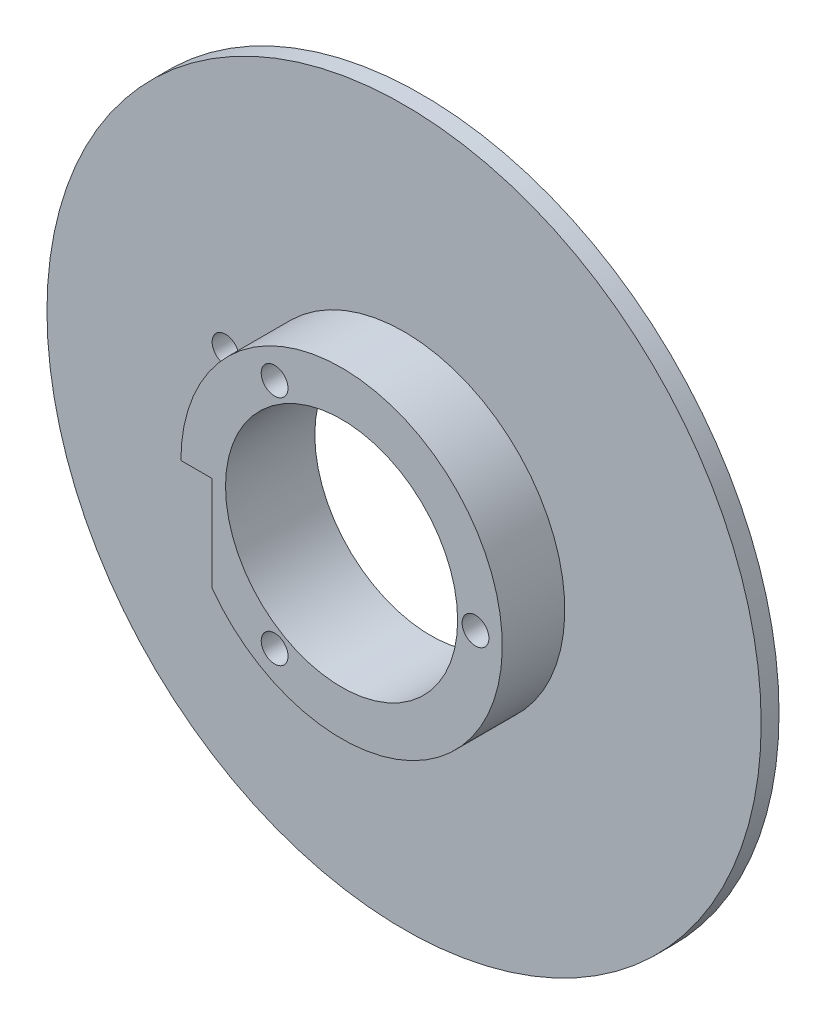
ISO-10303-21;
HEADER;
FILE_DESCRIPTION(('STEP AP214'),'2;1');
FILE_NAME('part.step','',(''),(''),'','','');
FILE_SCHEMA(('AUTOMOTIVE_DESIGN { 1 0 10303 214 1 1 1 1 }'));
ENDSEC;
DATA;
#1=APPLICATION_CONTEXT('core data for automotive mechanical design processes');
#2=APPLICATION_PROTOCOL_DEFINITION('international standard','automotive_design',2000,#1);
#3=PRODUCT_CONTEXT('',#1,'mechanical');
#4=PRODUCT('Part','Part','',(#3));
#5=PRODUCT_RELATED_PRODUCT_CATEGORY('part','',(#4));
#6=PRODUCT_DEFINITION_FORMATION('','',#4);
#7=PRODUCT_DEFINITION_CONTEXT('part definition',#1,'design');
#8=PRODUCT_DEFINITION('design','',#6,#7);
#9=PRODUCT_DEFINITION_SHAPE('','',#8);
#10=(LENGTH_UNIT() NAMED_UNIT(*) SI_UNIT(.MILLI.,.METRE.));
#11=(NAMED_UNIT(*) PLANE_ANGLE_UNIT() SI_UNIT($,.RADIAN.));
#12=(NAMED_UNIT(*) SI_UNIT($,.STERADIAN.) SOLID_ANGLE_UNIT());
#13=UNCERTAINTY_MEASURE_WITH_UNIT(LENGTH_MEASURE(1.E-05),#10,'distance_accuracy_value','');
#14=(GEOMETRIC_REPRESENTATION_CONTEXT(3) GLOBAL_UNCERTAINTY_ASSIGNED_CONTEXT((#13)) GLOBAL_UNIT_ASSIGNED_CONTEXT((#10,
#11,#12)) REPRESENTATION_CONTEXT('',''));
#15=CARTESIAN_POINT('',(0.,0.,0.));
#16=DIRECTION('',(0.,0.,1.));
#17=DIRECTION('',(1.,0.,0.));
#18=AXIS2_PLACEMENT_3D('',#15,#16,#17);
#19=CARTESIAN_POINT('',(0.,0.,-0.001000000000001));
#20=DIRECTION('',(0.,0.,1.));
#21=DIRECTION('',(1.,0.,0.));
#22=AXIS2_PLACEMENT_3D('',#19,#20,#21);
#23=CYLINDRICAL_SURFACE('',#22,13.);
#24=CARTESIAN_POINT('',(0.,0.,12.));
#25=DIRECTION('',(0.,0.,1.));
#26=DIRECTION('',(1.,0.,0.));
#27=AXIS2_PLACEMENT_3D('',#24,#25,#26);
#28=CIRCLE('',#27,13.);
#29=CARTESIAN_POINT('',(13.,0.,12.));
#30=VERTEX_POINT('',#29);
#31=EDGE_CURVE('E100',#30,#30,#28,.T.);
#32=ORIENTED_EDGE('',*,*,#31,.T.);
#33=EDGE_LOOP('',(#32));
#34=FACE_BOUND('',#33,.T.);
#35=CARTESIAN_POINT('',(0.,0.,2.));
#36=DIRECTION('',(0.,0.,-1.));
#37=DIRECTION('',(-1.,0.,0.));
#38=AXIS2_PLACEMENT_3D('',#35,#36,#37);
#39=CIRCLE('',#38,13.);
#40=CARTESIAN_POINT('',(-13.,0.,2.));
#41=VERTEX_POINT('',#40);
#42=EDGE_CURVE('E122',#41,#41,#39,.F.);
#43=ORIENTED_EDGE('',*,*,#42,.F.);
#44=EDGE_LOOP('',(#43));
#45=FACE_BOUND('',#44,.T.);
#46=ADVANCED_FACE('F35',(#34,#45),#23,.F.);
#47=CARTESIAN_POINT('',(-16.,-1.25,0.));
#48=DIRECTION('',(0.,0.,1.));
#49=DIRECTION('',(1.,0.,0.));
#50=AXIS2_PLACEMENT_3D('',#47,#48,#49);
#51=CYLINDRICAL_SURFACE('',#50,1.25);
#52=CARTESIAN_POINT('',(-16.,-1.25,5.));
#53=DIRECTION('',(0.,0.,1.));
#54=DIRECTION('',(1.,0.,0.));
#55=AXIS2_PLACEMENT_3D('',#52,#53,#54);
#56=CIRCLE('',#55,1.25);
#57=CARTESIAN_POINT('',(-16.,0.,5.));
#58=VERTEX_POINT('',#57);
#59=EDGE_CURVE('E50',#58,#58,#56,.T.);
#60=ORIENTED_EDGE('',*,*,#59,.T.);
#61=EDGE_LOOP('',(#60));
#62=FACE_BOUND('',#61,.T.);
#63=CARTESIAN_POINT('',(-16.,-1.25,2.));
#64=DIRECTION('',(0.,0.,-1.));
#65=DIRECTION('',(-1.,0.,0.));
#66=AXIS2_PLACEMENT_3D('',#63,#64,#65);
#67=CIRCLE('',#66,1.25);
#68=CARTESIAN_POINT('',(-17.25,-1.25,2.));
#69=VERTEX_POINT('',#68);
#70=EDGE_CURVE('E237',#69,#69,#67,.F.);
#71=ORIENTED_EDGE('',*,*,#70,.F.);
#72=EDGE_LOOP('',(#71));
#73=FACE_BOUND('',#72,.T.);
#74=ADVANCED_FACE('F166',(#62,#73),#51,.F.);
#75=CARTESIAN_POINT('',(15.,0.,0.));
#76=DIRECTION('',(0.,0.,1.));
#77=DIRECTION('',(1.,0.,0.));
#78=AXIS2_PLACEMENT_3D('',#75,#76,#77);
#79=CYLINDRICAL_SURFACE('',#78,1.5);
#80=CARTESIAN_POINT('',(15.,0.,12.));
#81=DIRECTION('',(0.,0.,1.));
#82=DIRECTION('',(1.,0.,0.));
#83=AXIS2_PLACEMENT_3D('',#80,#81,#82);
#84=CIRCLE('',#83,1.5);
#85=CARTESIAN_POINT('',(16.5,0.,12.));
#86=VERTEX_POINT('',#85);
#87=EDGE_CURVE('E141',#86,#86,#84,.T.);
#88=ORIENTED_EDGE('',*,*,#87,.T.);
#89=EDGE_LOOP('',(#88));
#90=FACE_BOUND('',#89,.T.);
#91=CARTESIAN_POINT('',(15.,0.,2.));
#92=DIRECTION('',(0.,0.,-1.));
#93=DIRECTION('',(-1.,0.,0.));
#94=AXIS2_PLACEMENT_3D('',#91,#92,#93);
#95=CIRCLE('',#94,1.5);
#96=CARTESIAN_POINT('',(13.5,0.,2.));
#97=VERTEX_POINT('',#96);
#98=EDGE_CURVE('E235',#97,#97,#95,.F.);
#99=ORIENTED_EDGE('',*,*,#98,.F.);
#100=EDGE_LOOP('',(#99));
#101=FACE_BOUND('',#100,.T.);
#102=ADVANCED_FACE('F172',(#90,#101),#79,.F.);
#103=CARTESIAN_POINT('',(-7.50000000000006,12.9903810567665,0.));
#104=DIRECTION('',(0.,0.,1.));
#105=DIRECTION('',(1.,0.,0.));
#106=AXIS2_PLACEMENT_3D('',#103,#104,#105);
#107=CYLINDRICAL_SURFACE('',#106,1.5);
#108=CARTESIAN_POINT('',(-7.50000000000006,12.9903810567665,12.));
#109=DIRECTION('',(0.,0.,1.));
#110=DIRECTION('',(-0.500000000000004,0.866025403784436,0.));
#111=AXIS2_PLACEMENT_3D('',#108,#109,#110);
#112=CIRCLE('',#111,1.5);
#113=CARTESIAN_POINT('',(-8.25000000000006,14.2894191624432,12.));
#114=VERTEX_POINT('',#113);
#115=EDGE_CURVE('E138',#114,#114,#112,.T.);
#116=ORIENTED_EDGE('',*,*,#115,.T.);
#117=EDGE_LOOP('',(#116));
#118=FACE_BOUND('',#117,.T.);
#119=CARTESIAN_POINT('',(-7.50000000000006,12.9903810567665,2.));
#120=DIRECTION('',(0.,0.,-1.));
#121=DIRECTION('',(-1.,0.,0.));
#122=AXIS2_PLACEMENT_3D('',#119,#120,#121);
#123=CIRCLE('',#122,1.5);
#124=CARTESIAN_POINT('',(-9.00000000000006,12.9903810567665,2.));
#125=VERTEX_POINT('',#124);
#126=EDGE_CURVE('E232',#125,#125,#123,.F.);
#127=ORIENTED_EDGE('',*,*,#126,.F.);
#128=EDGE_LOOP('',(#127));
#129=FACE_BOUND('',#128,.T.);
#130=ADVANCED_FACE('F184',(#118,#129),#107,.F.);
#131=CARTESIAN_POINT('',(-7.49999999999987,-12.9903810567666,0.));
#132=DIRECTION('',(0.,0.,1.));
#133=DIRECTION('',(1.,0.,0.));
#134=AXIS2_PLACEMENT_3D('',#131,#132,#133);
#135=CYLINDRICAL_SURFACE('',#134,1.5);
#136=CARTESIAN_POINT('',(-7.49999999999987,-12.9903810567666,12.));
#137=DIRECTION('',(0.,0.,1.));
#138=DIRECTION('',(-0.499999999999992,-0.866025403784443,0.));
#139=AXIS2_PLACEMENT_3D('',#136,#137,#138);
#140=CIRCLE('',#139,1.5);
#141=CARTESIAN_POINT('',(-8.24999999999986,-14.2894191624433,12.));
#142=VERTEX_POINT('',#141);
#143=EDGE_CURVE('E135',#142,#142,#140,.T.);
#144=ORIENTED_EDGE('',*,*,#143,.T.);
#145=EDGE_LOOP('',(#144));
#146=FACE_BOUND('',#145,.T.);
#147=CARTESIAN_POINT('',(-7.49999999999987,-12.9903810567666,2.));
#148=DIRECTION('',(0.,0.,-1.));
#149=DIRECTION('',(-1.,0.,0.));
#150=AXIS2_PLACEMENT_3D('',#147,#148,#149);
#151=CIRCLE('',#150,1.5);
#152=CARTESIAN_POINT('',(-8.99999999999987,-12.9903810567666,2.));
#153=VERTEX_POINT('',#152);
#154=EDGE_CURVE('E39',#153,#153,#151,.F.);
#155=ORIENTED_EDGE('',*,*,#154,.F.);
#156=EDGE_LOOP('',(#155));
#157=FACE_BOUND('',#156,.T.);
#158=ADVANCED_FACE('F188',(#146,#157),#135,.F.);
#159=CARTESIAN_POINT('',(0.,0.,5.));
#160=DIRECTION('',(0.,0.,-1.));
#161=DIRECTION('',(-1.,0.,0.));
#162=AXIS2_PLACEMENT_3D('',#159,#160,#161);
#163=CYLINDRICAL_SURFACE('',#162,40.);
#164=CARTESIAN_POINT('',(0.,0.,5.));
#165=DIRECTION('',(0.,0.,1.));
#166=DIRECTION('',(1.,0.,0.));
#167=AXIS2_PLACEMENT_3D('',#164,#165,#166);
#168=CIRCLE('',#167,40.);
#169=CARTESIAN_POINT('',(40.,0.,5.));
#170=VERTEX_POINT('',#169);
#171=EDGE_CURVE('E12',#170,#170,#168,.T.);
#172=ORIENTED_EDGE('',*,*,#171,.F.);
#173=EDGE_LOOP('',(#172));
#174=FACE_BOUND('',#173,.T.);
#175=CARTESIAN_POINT('',(0.,0.,3.));
#176=DIRECTION('',(0.,0.,-1.));
#177=DIRECTION('',(-1.,0.,0.));
#178=AXIS2_PLACEMENT_3D('',#175,#176,#177);
#179=CIRCLE('',#178,40.);
#180=CARTESIAN_POINT('',(-40.,0.,3.));
#181=VERTEX_POINT('',#180);
#182=EDGE_CURVE('E107',#181,#181,#179,.T.);
#183=ORIENTED_EDGE('',*,*,#182,.F.);
#184=EDGE_LOOP('',(#183));
#185=FACE_BOUND('',#184,.T.);
#186=ADVANCED_FACE('F37',(#174,#185),#163,.T.);
#187=CARTESIAN_POINT('',(0.,0.,0.));
#188=DIRECTION('',(0.,0.,1.));
#189=DIRECTION('',(1.,0.,0.));
#190=AXIS2_PLACEMENT_3D('',#187,#188,#189);
#191=PLANE('',#190);
#192=CARTESIAN_POINT('',(0.,0.,0.));
#193=DIRECTION('',(0.,0.,-1.));
#194=DIRECTION('',(-1.,0.,0.));
#195=AXIS2_PLACEMENT_3D('',#192,#193,#194);
#196=CIRCLE('',#195,18.);
#197=CARTESIAN_POINT('',(-18.,0.,0.));
#198=VERTEX_POINT('',#197);
#199=EDGE_CURVE('E225',#198,#198,#196,.T.);
#200=ORIENTED_EDGE('',*,*,#199,.F.);
#201=EDGE_LOOP('',(#200));
#202=FACE_BOUND('',#201,.T.);
#203=CARTESIAN_POINT('',(-19.9999999999999,6.25,0.));
#204=DIRECTION('',(0.,0.,-1.));
#205=DIRECTION('',(-1.,0.,0.));
#206=AXIS2_PLACEMENT_3D('',#203,#204,#205);
#207=CIRCLE('',#206,1.5);
#208=CARTESIAN_POINT('',(-21.5,6.25,0.));
#209=VERTEX_POINT('',#208);
#210=EDGE_CURVE('E129',#209,#209,#207,.T.);
#211=ORIENTED_EDGE('',*,*,#210,.F.);
#212=EDGE_LOOP('',(#211));
#213=FACE_BOUND('',#212,.T.);
#214=CARTESIAN_POINT('',(-20.,-8.75,0.));
#215=DIRECTION('',(0.,0.,-1.));
#216=DIRECTION('',(-1.,0.,0.));
#217=AXIS2_PLACEMENT_3D('',#214,#215,#216);
#218=CIRCLE('',#217,1.5);
#219=CARTESIAN_POINT('',(-21.5,-8.75,0.));
#220=VERTEX_POINT('',#219);
#221=EDGE_CURVE('E109',#220,#220,#218,.T.);
#222=ORIENTED_EDGE('',*,*,#221,.F.);
#223=EDGE_LOOP('',(#222));
#224=FACE_BOUND('',#223,.T.);
#225=CARTESIAN_POINT('',(0.,0.,0.));
#226=DIRECTION('',(0.,0.,-1.));
#227=DIRECTION('',(-1.,0.,0.));
#228=AXIS2_PLACEMENT_3D('',#225,#226,#227);
#229=CIRCLE('',#228,25.);
#230=CARTESIAN_POINT('',(-25.,0.,0.));
#231=VERTEX_POINT('',#230);
#232=EDGE_CURVE('E117',#231,#231,#229,.T.);
#233=ORIENTED_EDGE('',*,*,#232,.T.);
#234=EDGE_LOOP('',(#233));
#235=FACE_BOUND('',#234,.T.);
#236=ADVANCED_FACE('F160',(#202,#213,#224,#235),#191,.F.);
#237=CARTESIAN_POINT('',(0.,0.,5.));
#238=DIRECTION('',(0.,0.,1.));
#239=DIRECTION('',(1.,0.,0.));
#240=AXIS2_PLACEMENT_3D('',#237,#238,#239);
#241=PLANE('',#240);
#242=CARTESIAN_POINT('',(-20.,-8.75,5.));
#243=DIRECTION('',(0.,0.,1.));
#244=DIRECTION('',(1.,0.,0.));
#245=AXIS2_PLACEMENT_3D('',#242,#243,#244);
#246=CIRCLE('',#245,1.5);
#247=CARTESIAN_POINT('',(-18.5,-8.75,5.));
#248=VERTEX_POINT('',#247);
#249=EDGE_CURVE('E114',#248,#248,#246,.T.);
#250=ORIENTED_EDGE('',*,*,#249,.F.);
#251=EDGE_LOOP('',(#250));
#252=FACE_BOUND('',#251,.T.);
#253=CARTESIAN_POINT('',(-19.9999999999999,6.25,5.));
#254=DIRECTION('',(0.,0.,1.));
#255=DIRECTION('',(1.,0.,0.));
#256=AXIS2_PLACEMENT_3D('',#253,#254,#255);
#257=CIRCLE('',#256,1.5);
#258=CARTESIAN_POINT('',(-18.4999999999999,6.25,5.));
#259=VERTEX_POINT('',#258);
#260=EDGE_CURVE('E132',#259,#259,#257,.T.);
#261=ORIENTED_EDGE('',*,*,#260,.F.);
#262=EDGE_LOOP('',(#261));
#263=FACE_BOUND('',#262,.T.);
#264=DIRECTION('',(1.,0.,0.));
#265=VECTOR('',#264,1.);
#266=CARTESIAN_POINT('',(-18.,0.,5.));
#267=LINE('',#266,#265);
#268=CARTESIAN_POINT('',(-14.5,0.,5.));
#269=VERTEX_POINT('',#268);
#270=EDGE_CURVE('E82',#58,#269,#267,.T.);
#271=ORIENTED_EDGE('',*,*,#270,.F.);
#272=ORIENTED_EDGE('',*,*,#59,.F.);
#273=CARTESIAN_POINT('',(-18.,0.,5.));
#274=VERTEX_POINT('',#273);
#275=EDGE_CURVE('E104',#274,#58,#267,.T.);
#276=ORIENTED_EDGE('',*,*,#275,.F.);
#277=CARTESIAN_POINT('',(0.,0.,5.));
#278=DIRECTION('',(0.,0.,1.));
#279=DIRECTION('',(1.,0.,0.));
#280=AXIS2_PLACEMENT_3D('',#277,#278,#279);
#281=CIRCLE('',#280,18.);
#282=CARTESIAN_POINT('',(-14.5,-10.6653645038508,5.));
#283=VERTEX_POINT('',#282);
#284=EDGE_CURVE('E103',#283,#274,#281,.T.);
#285=ORIENTED_EDGE('',*,*,#284,.F.);
#286=DIRECTION('',(0.,-1.,0.));
#287=VECTOR('',#286,1.);
#288=CARTESIAN_POINT('',(-14.5,0.,5.));
#289=LINE('',#288,#287);
#290=EDGE_CURVE('E98',#269,#283,#289,.T.);
#291=ORIENTED_EDGE('',*,*,#290,.F.);
#292=EDGE_LOOP('',(#271,#272,#276,#285,#291));
#293=FACE_BOUND('',#292,.T.);
#294=ORIENTED_EDGE('',*,*,#171,.T.);
#295=EDGE_LOOP('',(#294));
#296=FACE_BOUND('',#295,.T.);
#297=ADVANCED_FACE('F147',(#252,#263,#293,#296),#241,.T.);
#298=CARTESIAN_POINT('',(0.,0.,12.));
#299=DIRECTION('',(0.,0.,-1.));
#300=DIRECTION('',(-1.,0.,0.));
#301=AXIS2_PLACEMENT_3D('',#298,#299,#300);
#302=CYLINDRICAL_SURFACE('',#301,18.);
#303=CARTESIAN_POINT('',(-16.,8.24621125123531,6.99999999999999));
#304=CARTESIAN_POINT('',(-15.9613810360273,8.32114346397686,7.0000016263652));
#305=CARTESIAN_POINT('',(-15.9222363186604,8.39580114899752,7.00223152049244));
#306=CARTESIAN_POINT('',(-15.843035174205,8.54431475928277,7.01159061047103));
#307=CARTESIAN_POINT('',(-15.8029789444741,8.61817085308542,7.01871875534757));
#308=CARTESIAN_POINT('',(-15.7221474509637,8.7647634720665,7.03847526886184));
#309=CARTESIAN_POINT('',(-15.6813722365588,8.83750007348587,7.0511032612113));
#310=CARTESIAN_POINT('',(-15.5994478826954,8.98131842431563,7.08267587815209));
#311=CARTESIAN_POINT('',(-15.5582989842929,9.05240114794279,7.10161667795411));
#312=CARTESIAN_POINT('',(-15.4673718942982,9.20706266816792,7.15173330893178));
#313=CARTESIAN_POINT('',(-15.4176014437032,9.29012041232406,7.18464577802709));
#314=CARTESIAN_POINT('',(-15.3443481539485,9.41027069847238,7.24428853029069));
#315=CARTESIAN_POINT('',(-15.3201944569461,9.44953348183938,7.26584729826322));
#316=CARTESIAN_POINT('',(-15.272684029808,9.52612950820349,7.31288247970974));
#317=CARTESIAN_POINT('',(-15.2493266344292,9.56346437593623,7.33835552002104));
#318=CARTESIAN_POINT('',(-15.2043549540248,9.63479800449547,7.39322030307094));
#319=CARTESIAN_POINT('',(-15.1827148254229,9.66884929503873,7.42252147493258));
#320=CARTESIAN_POINT('',(-15.1413676089115,9.73347078582315,7.48601147810083));
#321=CARTESIAN_POINT('',(-15.1216598950257,9.76404211386482,7.52019871776242));
#322=CARTESIAN_POINT('',(-15.0881076599514,9.81579370684003,7.58811196176378));
#323=CARTESIAN_POINT('',(-15.0738284872362,9.83769475412273,7.62106476641484));
#324=CARTESIAN_POINT('',(-15.0482915236492,9.87671332847282,7.69077335626779));
#325=CARTESIAN_POINT('',(-15.0370284699269,9.89383918998264,7.72752236006487));
#326=CARTESIAN_POINT('',(-15.0205527951927,9.91882899449617,7.79594547367171));
#327=CARTESIAN_POINT('',(-15.0145572700433,9.92789684753955,7.82698729867992));
#328=CARTESIAN_POINT('',(-15.005503064186,9.94157666181556,7.89045487563609));
#329=CARTESIAN_POINT('',(-15.0024420054344,9.94619223112513,7.92287948470144));
#330=CARTESIAN_POINT('',(-14.9995306327531,9.95058232716388,7.98831359222039));
#331=CARTESIAN_POINT('',(-14.9996909162677,9.95034087545491,8.02132466410337));
#332=CARTESIAN_POINT('',(-15.0032326471308,9.94499972722101,8.08677578546125));
#333=CARTESIAN_POINT('',(-15.0066151686016,9.93989841067613,8.11921564085032));
#334=CARTESIAN_POINT('',(-15.0160894273721,9.92557941070428,8.18129138474907));
#335=CARTESIAN_POINT('',(-15.0220634506199,9.91654051634072,8.21098774698774));
#336=CARTESIAN_POINT('',(-15.0362650384914,9.89499371099593,8.2685033842677));
#337=CARTESIAN_POINT('',(-15.0444934392672,9.88248451285221,8.29632195805348));
#338=CARTESIAN_POINT('',(-15.0679248618022,9.84674118511798,8.36495749268957));
#339=CARTESIAN_POINT('',(-15.0844430414207,9.82143894466121,8.40424775550381));
#340=CARTESIAN_POINT('',(-15.1204728618183,9.76587979310348,8.47761001354602));
#341=CARTESIAN_POINT('',(-15.1399928376072,9.73560906988412,8.51166693427089));
#342=CARTESIAN_POINT('',(-15.1937214207466,9.65166280422465,8.59470168661542));
#343=CARTESIAN_POINT('',(-15.2295070422709,9.59515163922994,8.63976323863986));
#344=CARTESIAN_POINT('',(-15.3034560732536,9.47676917608623,8.71957585797191));
#345=CARTESIAN_POINT('',(-15.3416245097552,9.41488643026102,8.75430417026482));
#346=CARTESIAN_POINT('',(-15.415666421671,9.29310899791827,8.81276084790355));
#347=CARTESIAN_POINT('',(-15.4514618818731,9.23348697013425,8.83717000638175));
#348=CARTESIAN_POINT('',(-15.5232745723358,9.11224009653214,8.88004712134471));
#349=CARTESIAN_POINT('',(-15.5592919602388,9.0506136501307,8.89851019477245));
#350=CARTESIAN_POINT('',(-15.631202944733,8.92584394322628,8.93034231513794));
#351=CARTESIAN_POINT('',(-15.6670961713828,8.86269800012377,8.94370152358333));
#352=CARTESIAN_POINT('',(-15.7384470923891,8.73536587952441,8.96591131351949));
#353=CARTESIAN_POINT('',(-15.7739046331667,8.6711793527246,8.97476034728945));
#354=CARTESIAN_POINT('',(-15.8708765476014,8.49305421048156,8.99363143555357));
#355=CARTESIAN_POINT('',(-15.9317522173512,8.37831223842818,8.99945072275903));
#356=CARTESIAN_POINT('',(-16.0510413895161,8.14745289217276,9.0004752596151));
#357=CARTESIAN_POINT('',(-16.1094527045813,8.03133440859103,8.99567127400947));
#358=CARTESIAN_POINT('',(-16.2234765882214,7.79843764772273,8.97642357332456));
#359=CARTESIAN_POINT('',(-16.2790871842455,7.68165896810478,8.9619731636037));
#360=CARTESIAN_POINT('',(-16.3871900481901,7.44825616052386,8.92378256016411));
#361=CARTESIAN_POINT('',(-16.4396844464687,7.33163198153019,8.90004879915618));
#362=CARTESIAN_POINT('',(-16.5164840064985,7.15611392093431,8.8568129877488));
#363=CARTESIAN_POINT('',(-16.5420287883222,7.09685872977176,8.84091064147199));
#364=CARTESIAN_POINT('',(-16.5921970428508,6.97876127683229,8.80636946950834));
#365=CARTESIAN_POINT('',(-16.6168206677166,6.91991894817311,8.7877310982978));
#366=CARTESIAN_POINT('',(-16.6649901437868,6.80309344580329,8.74750864052945));
#367=CARTESIAN_POINT('',(-16.6885398281258,6.74510781441918,8.7259363409095));
#368=CARTESIAN_POINT('',(-16.7345570207122,6.63011543745193,8.6793377808582));
#369=CARTESIAN_POINT('',(-16.7570249782641,6.57310829188943,8.65431297144691));
#370=CARTESIAN_POINT('',(-16.7977070758567,6.46836498738277,8.60379314982165));
#371=CARTESIAN_POINT('',(-16.8160810582034,6.42043276657923,8.57883695645679));
#372=CARTESIAN_POINT('',(-16.8517867363182,6.32612277407133,8.52489174666344));
#373=CARTESIAN_POINT('',(-16.8691135498232,6.27975267225899,8.49588565767342));
#374=CARTESIAN_POINT('',(-16.9024766391883,6.18939712230061,8.43226776447946));
#375=CARTESIAN_POINT('',(-16.9184907910405,6.14545551908967,8.3975813930173));
#376=CARTESIAN_POINT('',(-16.9480085834646,6.06356659572869,8.32087534879257));
#377=CARTESIAN_POINT('',(-16.9615324692576,6.02557135150473,8.27892073789707));
#378=CARTESIAN_POINT('',(-16.9769124462773,5.98202435258441,8.21439244107213));
#379=CARTESIAN_POINT('',(-16.9807859080377,5.9710149865607,8.19604506762374));
#380=CARTESIAN_POINT('',(-16.9876460569709,5.95146922779873,8.15789786378946));
#381=CARTESIAN_POINT('',(-16.9906330619758,5.9429319487398,8.13809855716586));
#382=CARTESIAN_POINT('',(-16.9955021564396,5.92899346240937,8.09699060134567));
#383=CARTESIAN_POINT('',(-16.9973705459889,5.92363114801847,8.07566668165258));
#384=CARTESIAN_POINT('',(-16.9997117126049,5.91690929377916,8.03232618788239));
#385=CARTESIAN_POINT('',(-17.0001865345711,5.91554388893587,8.01031067666598));
#386=CARTESIAN_POINT('',(-16.9997067350194,5.91692237604207,7.96889217205053));
#387=CARTESIAN_POINT('',(-16.9989052208164,5.91922612735466,7.94947094056677));
#388=CARTESIAN_POINT('',(-16.9962433570875,5.92686492298391,7.91130925468124));
#389=CARTESIAN_POINT('',(-16.9943819468858,5.93220300385347,7.89256950227624));
#390=CARTESIAN_POINT('',(-16.988926998587,5.94781040663769,7.84949497956166));
#391=CARTESIAN_POINT('',(-16.9849495056019,5.95916767468341,7.82560848379701));
#392=CARTESIAN_POINT('',(-16.9757806396857,5.98523720822826,7.78000933041884));
#393=CARTESIAN_POINT('',(-16.9705862844414,5.99995771419819,7.75830220383709));
#394=CARTESIAN_POINT('',(-16.9548744059359,6.04426422942778,7.70049784524241));
#395=CARTESIAN_POINT('',(-16.9434011430569,6.07638432036652,7.66663335343101));
#396=CARTESIAN_POINT('',(-16.9188050738792,6.14453995984615,7.60385449629394));
#397=CARTESIAN_POINT('',(-16.9056770314533,6.18058788564159,7.5749565644185));
#398=CARTESIAN_POINT('',(-16.872146115004,6.27167977266058,7.50878247795995));
#399=CARTESIAN_POINT('',(-16.851124403921,6.32798288320092,7.47357399533749));
#400=CARTESIAN_POINT('',(-16.8074265985106,6.44315428365218,7.40874602880425));
#401=CARTESIAN_POINT('',(-16.7847471762715,6.50202763243196,7.37913824089165));
#402=CARTESIAN_POINT('',(-16.7379640260374,6.62153262045138,7.32419271569663));
#403=CARTESIAN_POINT('',(-16.7138543065549,6.68217102142056,7.29887494713918));
#404=CARTESIAN_POINT('',(-16.6644994311463,6.80432228678962,7.25193873506722));
#405=CARTESIAN_POINT('',(-16.6392552280243,6.86583438876777,7.23031725790219));
#406=CARTESIAN_POINT('',(-16.5681360585533,7.0363860058073,7.1750572147749));
#407=CARTESIAN_POINT('',(-16.5211494017442,7.14605159238276,7.14475851953422));
#408=CARTESIAN_POINT('',(-16.4241900637478,7.36617110258265,7.09276218176061));
#409=CARTESIAN_POINT('',(-16.3742148818435,7.4766256163443,7.07107186172421));
#410=CARTESIAN_POINT('',(-16.271632096781,7.69732163333594,7.03607798616806));
#411=CARTESIAN_POINT('',(-16.2190309380193,7.80756302905002,7.02275489292081));
#412=CARTESIAN_POINT('',(-16.1113235505484,8.02746708322505,7.004717309457));
#413=CARTESIAN_POINT('',(-16.0562188517166,8.13713005061347,6.99999763244854));
#414=CARTESIAN_POINT('',(-16.,8.24621125123531,6.99999999999999));
#415=B_SPLINE_CURVE_WITH_KNOTS('',3,(#303,#304,#305,#306,#307,#308,#309,#310,#311,#312,#313,
#314,#315,#316,#317,#318,#319,#320,#321,#322,#323,#324,#325,#326,#327,#328,#329,#330,#331,#332,
#333,#334,#335,#336,#337,#338,#339,#340,#341,#342,#343,#344,#345,#346,#347,#348,#349,#350,#351,
#352,#353,#354,#355,#356,#357,#358,#359,#360,#361,#362,#363,#364,#365,#366,#367,#368,#369,#370,
#371,#372,#373,#374,#375,#376,#377,#378,#379,#380,#381,#382,#383,#384,#385,#386,#387,#388,#389,
#390,#391,#392,#393,#394,#395,#396,#397,#398,#399,#400,#401,#402,#403,#404,#405,#406,#407,#408,
#409,#410,#411,#412,#413,#414),.UNSPECIFIED.,.T.,.F.,(4,2,2,2,2,2,2,2,2,2,2,2,2,2,2,2,2,2,2,2,2,
2,2,2,2,2,2,2,2,2,2,2,2,2,2,2,2,2,2,2,2,2,2,2,2,2,2,2,2,2,2,2,2,2,2,4),(0.,0.252851828170388,
0.505649421068519,0.758429720790111,1.01105714413505,1.31688846563067,1.46941012803559,
1.62180108297498,1.77108238687304,1.92031517249872,2.04607585590698,2.17161564707916,
2.26987797604154,2.36806060733428,2.46656628868207,2.56510481806868,2.65957192890044,
2.75407412526794,2.9019208291409,3.05018572543069,3.29078476893834,3.53190978403184,
3.75269417538976,3.97365942016692,4.19504848608176,4.41651347325888,4.80598599849093,
5.19579724160609,5.58587929630167,5.97569152900147,6.1750135863083,6.37430257196492,
6.57281335331561,6.77124095732079,6.94235669236345,7.11421687120715,7.28854678158979,
7.46138998790119,7.52646351440515,7.59151368103983,7.65734504644848,7.7230797635241,
7.78150355945163,7.83998592517602,7.91976980865428,7.9997513125785,8.14313254987642,
8.28697943912035,8.49544338514335,8.70433797567375,8.91417967878987,9.12384832335755,
9.49270704524551,9.8618788584215,10.230185407486,10.5982698398967),.UNSPECIFIED.);
#416=CARTESIAN_POINT('',(-16.,8.24621125123531,6.99999999999999));
#417=VERTEX_POINT('',#416);
#418=EDGE_CURVE('E220',#417,#417,#415,.T.);
#419=ORIENTED_EDGE('',*,*,#418,.T.);
#420=EDGE_LOOP('',(#419));
#421=FACE_BOUND('',#420,.T.);
#422=ORIENTED_EDGE('',*,*,#284,.T.);
#423=DIRECTION('',(0.,0.,1.));
#424=VECTOR('',#423,1.);
#425=CARTESIAN_POINT('',(-18.,0.,-6.22497216032182));
#426=LINE('',#425,#424);
#427=CARTESIAN_POINT('',(-18.,0.,12.));
#428=VERTEX_POINT('',#427);
#429=EDGE_CURVE('E84',#274,#428,#426,.T.);
#430=ORIENTED_EDGE('',*,*,#429,.T.);
#431=CARTESIAN_POINT('',(0.,0.,12.));
#432=DIRECTION('',(0.,0.,1.));
#433=DIRECTION('',(1.,0.,0.));
#434=AXIS2_PLACEMENT_3D('',#431,#432,#433);
#435=CIRCLE('',#434,18.);
#436=CARTESIAN_POINT('',(-14.5,-10.6653645038508,12.));
#437=VERTEX_POINT('',#436);
#438=EDGE_CURVE('E44',#437,#428,#435,.T.);
#439=ORIENTED_EDGE('',*,*,#438,.F.);
#440=DIRECTION('',(0.,0.,1.));
#441=VECTOR('',#440,1.);
#442=CARTESIAN_POINT('',(-14.5,-10.6653645038508,-6.22497216032182));
#443=LINE('',#442,#441);
#444=EDGE_CURVE('E57',#283,#437,#443,.T.);
#445=ORIENTED_EDGE('',*,*,#444,.F.);
#446=EDGE_LOOP('',(#422,#430,#439,#445));
#447=FACE_BOUND('',#446,.T.);
#448=ADVANCED_FACE('F150',(#421,#447),#302,.T.);
#449=CARTESIAN_POINT('',(0.,0.,12.));
#450=DIRECTION('',(0.,0.,1.));
#451=DIRECTION('',(1.,0.,0.));
#452=AXIS2_PLACEMENT_3D('',#449,#450,#451);
#453=PLANE('',#452);
#454=ORIENTED_EDGE('',*,*,#143,.F.);
#455=EDGE_LOOP('',(#454));
#456=FACE_BOUND('',#455,.T.);
#457=ORIENTED_EDGE('',*,*,#115,.F.);
#458=EDGE_LOOP('',(#457));
#459=FACE_BOUND('',#458,.T.);
#460=ORIENTED_EDGE('',*,*,#87,.F.);
#461=EDGE_LOOP('',(#460));
#462=FACE_BOUND('',#461,.T.);
#463=DIRECTION('',(-1.,0.,0.));
#464=VECTOR('',#463,1.);
#465=CARTESIAN_POINT('',(-18.,0.,12.));
#466=LINE('',#465,#464);
#467=CARTESIAN_POINT('',(-14.5,0.,12.));
#468=VERTEX_POINT('',#467);
#469=EDGE_CURVE('E79',#468,#428,#466,.T.);
#470=ORIENTED_EDGE('',*,*,#469,.F.);
#471=DIRECTION('',(0.,1.,0.));
#472=VECTOR('',#471,1.);
#473=CARTESIAN_POINT('',(-14.5,0.,12.));
#474=LINE('',#473,#472);
#475=EDGE_CURVE('E86',#437,#468,#474,.T.);
#476=ORIENTED_EDGE('',*,*,#475,.F.);
#477=ORIENTED_EDGE('',*,*,#438,.T.);
#478=EDGE_LOOP('',(#470,#476,#477));
#479=FACE_BOUND('',#478,.T.);
#480=ORIENTED_EDGE('',*,*,#31,.F.);
#481=EDGE_LOOP('',(#480));
#482=FACE_BOUND('',#481,.T.);
#483=ADVANCED_FACE('F92',(#456,#459,#462,#479,#482),#453,.T.);
#484=CARTESIAN_POINT('',(-18.,0.,-6.22497216032182));
#485=DIRECTION('',(0.,1.,0.));
#486=DIRECTION('',(0.,0.,1.));
#487=AXIS2_PLACEMENT_3D('',#484,#485,#486);
#488=PLANE('',#487);
#489=CARTESIAN_POINT('',(-16.,0.,8.00000000000001));
#490=DIRECTION('',(0.,-1.,0.));
#491=DIRECTION('',(0.,0.,-1.));
#492=AXIS2_PLACEMENT_3D('',#489,#490,#491);
#493=CIRCLE('',#492,1.);
#494=CARTESIAN_POINT('',(-16.,0.,7.00000000000001));
#495=VERTEX_POINT('',#494);
#496=EDGE_CURVE('E226',#495,#495,#493,.T.);
#497=ORIENTED_EDGE('',*,*,#496,.F.);
#498=EDGE_LOOP('',(#497));
#499=FACE_BOUND('',#498,.T.);
#500=ORIENTED_EDGE('',*,*,#275,.T.);
#501=ORIENTED_EDGE('',*,*,#270,.T.);
#502=DIRECTION('',(0.,0.,1.));
#503=VECTOR('',#502,1.);
#504=CARTESIAN_POINT('',(-14.5,0.,-6.22497216032182));
#505=LINE('',#504,#503);
#506=EDGE_CURVE('E74',#269,#468,#505,.T.);
#507=ORIENTED_EDGE('',*,*,#506,.T.);
#508=ORIENTED_EDGE('',*,*,#469,.T.);
#509=ORIENTED_EDGE('',*,*,#429,.F.);
#510=EDGE_LOOP('',(#500,#501,#507,#508,#509));
#511=FACE_BOUND('',#510,.T.);
#512=ADVANCED_FACE('F76',(#499,#511),#488,.F.);
#513=CARTESIAN_POINT('',(-14.5,0.,-6.22497216032182));
#514=DIRECTION('',(1.,0.,0.));
#515=DIRECTION('',(0.,1.,0.));
#516=AXIS2_PLACEMENT_3D('',#513,#514,#515);
#517=PLANE('',#516);
#518=ORIENTED_EDGE('',*,*,#290,.T.);
#519=ORIENTED_EDGE('',*,*,#444,.T.);
#520=ORIENTED_EDGE('',*,*,#475,.T.);
#521=ORIENTED_EDGE('',*,*,#506,.F.);
#522=EDGE_LOOP('',(#518,#519,#520,#521));
#523=FACE_BOUND('',#522,.T.);
#524=ADVANCED_FACE('F87',(#523),#517,.F.);
#525=CARTESIAN_POINT('',(-19.9999999999999,6.25,12.));
#526=DIRECTION('',(0.,0.,-1.));
#527=DIRECTION('',(-1.,0.,0.));
#528=AXIS2_PLACEMENT_3D('',#525,#526,#527);
#529=CYLINDRICAL_SURFACE('',#528,1.5);
#530=ORIENTED_EDGE('',*,*,#260,.T.);
#531=EDGE_LOOP('',(#530));
#532=FACE_BOUND('',#531,.T.);
#533=ORIENTED_EDGE('',*,*,#210,.T.);
#534=EDGE_LOOP('',(#533));
#535=FACE_BOUND('',#534,.T.);
#536=ADVANCED_FACE('F178',(#532,#535),#529,.F.);
#537=CARTESIAN_POINT('',(-20.,-8.75,12.));
#538=DIRECTION('',(0.,0.,-1.));
#539=DIRECTION('',(-1.,0.,0.));
#540=AXIS2_PLACEMENT_3D('',#537,#538,#539);
#541=CYLINDRICAL_SURFACE('',#540,1.5);
#542=ORIENTED_EDGE('',*,*,#249,.T.);
#543=EDGE_LOOP('',(#542));
#544=FACE_BOUND('',#543,.T.);
#545=ORIENTED_EDGE('',*,*,#221,.T.);
#546=EDGE_LOOP('',(#545));
#547=FACE_BOUND('',#546,.T.);
#548=ADVANCED_FACE('F195',(#544,#547),#541,.F.);
#549=CARTESIAN_POINT('',(0.,0.,3.));
#550=DIRECTION('',(0.,0.,-1.));
#551=DIRECTION('',(-1.,0.,0.));
#552=AXIS2_PLACEMENT_3D('',#549,#550,#551);
#553=PLANE('',#552);
#554=CARTESIAN_POINT('',(0.,0.,3.));
#555=DIRECTION('',(0.,0.,-1.));
#556=DIRECTION('',(-1.,0.,0.));
#557=AXIS2_PLACEMENT_3D('',#554,#555,#556);
#558=CIRCLE('',#557,25.);
#559=CARTESIAN_POINT('',(-25.,0.,3.));
#560=VERTEX_POINT('',#559);
#561=EDGE_CURVE('E110',#560,#560,#558,.T.);
#562=ORIENTED_EDGE('',*,*,#561,.F.);
#563=EDGE_LOOP('',(#562));
#564=FACE_BOUND('',#563,.T.);
#565=ORIENTED_EDGE('',*,*,#182,.T.);
#566=EDGE_LOOP('',(#565));
#567=FACE_BOUND('',#566,.T.);
#568=ADVANCED_FACE('F199',(#564,#567),#553,.T.);
#569=CARTESIAN_POINT('',(0.,0.,3.));
#570=DIRECTION('',(0.,0.,-1.));
#571=DIRECTION('',(-1.,0.,0.));
#572=AXIS2_PLACEMENT_3D('',#569,#570,#571);
#573=CYLINDRICAL_SURFACE('',#572,25.);
#574=ORIENTED_EDGE('',*,*,#561,.T.);
#575=EDGE_LOOP('',(#574));
#576=FACE_BOUND('',#575,.T.);
#577=ORIENTED_EDGE('',*,*,#232,.F.);
#578=EDGE_LOOP('',(#577));
#579=FACE_BOUND('',#578,.T.);
#580=ADVANCED_FACE('F203',(#576,#579),#573,.T.);
#581=CARTESIAN_POINT('',(0.,0.,2.));
#582=DIRECTION('',(0.,0.,-1.));
#583=DIRECTION('',(-1.,0.,0.));
#584=AXIS2_PLACEMENT_3D('',#581,#582,#583);
#585=PLANE('',#584);
#586=ORIENTED_EDGE('',*,*,#70,.T.);
#587=EDGE_LOOP('',(#586));
#588=FACE_BOUND('',#587,.T.);
#589=ORIENTED_EDGE('',*,*,#126,.T.);
#590=EDGE_LOOP('',(#589));
#591=FACE_BOUND('',#590,.T.);
#592=CARTESIAN_POINT('',(0.,0.,2.));
#593=DIRECTION('',(0.,0.,-1.));
#594=DIRECTION('',(-1.,0.,0.));
#595=AXIS2_PLACEMENT_3D('',#592,#593,#594);
#596=CIRCLE('',#595,18.);
#597=CARTESIAN_POINT('',(-18.,0.,2.));
#598=VERTEX_POINT('',#597);
#599=EDGE_CURVE('E227',#598,#598,#596,.T.);
#600=ORIENTED_EDGE('',*,*,#599,.T.);
#601=EDGE_LOOP('',(#600));
#602=FACE_BOUND('',#601,.T.);
#603=ORIENTED_EDGE('',*,*,#154,.T.);
#604=EDGE_LOOP('',(#603));
#605=FACE_BOUND('',#604,.T.);
#606=ORIENTED_EDGE('',*,*,#98,.T.);
#607=EDGE_LOOP('',(#606));
#608=FACE_BOUND('',#607,.T.);
#609=ORIENTED_EDGE('',*,*,#42,.T.);
#610=EDGE_LOOP('',(#609));
#611=FACE_BOUND('',#610,.T.);
#612=ADVANCED_FACE('F207',(#588,#591,#602,#605,#608,#611),#585,.T.);
#613=CARTESIAN_POINT('',(0.,0.,2.));
#614=DIRECTION('',(0.,0.,-1.));
#615=DIRECTION('',(-1.,0.,0.));
#616=AXIS2_PLACEMENT_3D('',#613,#614,#615);
#617=CYLINDRICAL_SURFACE('',#616,18.);
#618=ORIENTED_EDGE('',*,*,#599,.F.);
#619=EDGE_LOOP('',(#618));
#620=FACE_BOUND('',#619,.T.);
#621=ORIENTED_EDGE('',*,*,#199,.T.);
#622=EDGE_LOOP('',(#621));
#623=FACE_BOUND('',#622,.T.);
#624=ADVANCED_FACE('F208',(#620,#623),#617,.F.);
#625=CARTESIAN_POINT('',(-16.,40.,8.00000000000001));
#626=DIRECTION('',(0.,-1.,0.));
#627=DIRECTION('',(0.,0.,-1.));
#628=AXIS2_PLACEMENT_3D('',#625,#626,#627);
#629=CYLINDRICAL_SURFACE('',#628,1.);
#630=ORIENTED_EDGE('',*,*,#496,.T.);
#631=EDGE_LOOP('',(#630));
#632=FACE_BOUND('',#631,.T.);
#633=ORIENTED_EDGE('',*,*,#418,.F.);
#634=EDGE_LOOP('',(#633));
#635=FACE_BOUND('',#634,.T.);
#636=ADVANCED_FACE('F211',(#632,#635),#629,.F.);
#637=CLOSED_SHELL('',(#46,#74,#102,#130,#158,#186,#236,#297,#448,#483,#512,#524,#536,#548,#568,
#580,#612,#624,#636));
#638=MANIFOLD_SOLID_BREP('B2',#637);
#639=ADVANCED_BREP_SHAPE_REPRESENTATION('',(#18,#638),#14);
#640=SHAPE_DEFINITION_REPRESENTATION(#9,#639);
ENDSEC;
END-ISO-10303-21;
